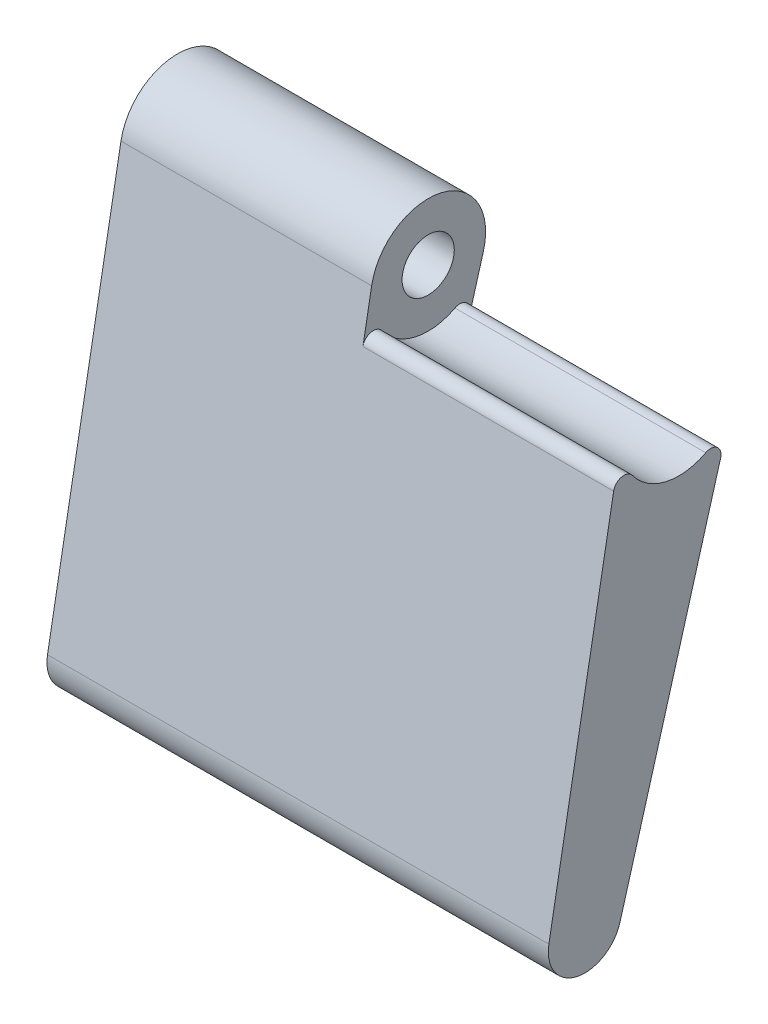
ISO-10303-21;
HEADER;
FILE_DESCRIPTION(('STEP AP214'),'2;1');
FILE_NAME('part.step','',(''),(''),'','','');
FILE_SCHEMA(('AUTOMOTIVE_DESIGN { 1 0 10303 214 1 1 1 1 }'));
ENDSEC;
DATA;
#1=APPLICATION_CONTEXT('core data for automotive mechanical design processes');
#2=APPLICATION_PROTOCOL_DEFINITION('international standard','automotive_design',2000,#1);
#3=PRODUCT_CONTEXT('',#1,'mechanical');
#4=PRODUCT('Part','Part','',(#3));
#5=PRODUCT_RELATED_PRODUCT_CATEGORY('part','',(#4));
#6=PRODUCT_DEFINITION_FORMATION('','',#4);
#7=PRODUCT_DEFINITION_CONTEXT('part definition',#1,'design');
#8=PRODUCT_DEFINITION('design','',#6,#7);
#9=PRODUCT_DEFINITION_SHAPE('','',#8);
#10=(LENGTH_UNIT() NAMED_UNIT(*) SI_UNIT(.MILLI.,.METRE.));
#11=(NAMED_UNIT(*) PLANE_ANGLE_UNIT() SI_UNIT($,.RADIAN.));
#12=(NAMED_UNIT(*) SI_UNIT($,.STERADIAN.) SOLID_ANGLE_UNIT());
#13=UNCERTAINTY_MEASURE_WITH_UNIT(LENGTH_MEASURE(1.E-05),#10,'distance_accuracy_value','');
#14=(GEOMETRIC_REPRESENTATION_CONTEXT(3) GLOBAL_UNCERTAINTY_ASSIGNED_CONTEXT((#13)) GLOBAL_UNIT_ASSIGNED_CONTEXT((#10,
#11,#12)) REPRESENTATION_CONTEXT('',''));
#15=CARTESIAN_POINT('',(0.,0.,0.));
#16=DIRECTION('',(0.,0.,1.));
#17=DIRECTION('',(1.,0.,0.));
#18=AXIS2_PLACEMENT_3D('',#15,#16,#17);
#19=CARTESIAN_POINT('',(63.25,0.,0.));
#20=DIRECTION('',(1.,0.,0.));
#21=DIRECTION('',(0.,0.,-1.));
#22=AXIS2_PLACEMENT_3D('',#19,#20,#21);
#23=PLANE('',#22);
#24=CARTESIAN_POINT('',(63.25,-53.325,78.5));
#25=DIRECTION('',(1.,0.,0.));
#26=DIRECTION('',(0.,0.,-1.));
#27=AXIS2_PLACEMENT_3D('',#24,#25,#26);
#28=CIRCLE('',#27,1.375);
#29=CARTESIAN_POINT('',(63.25,-54.1329219866742,79.6126037315453));
#30=VERTEX_POINT('',#29);
#31=CARTESIAN_POINT('',(63.25,-54.5408078695236,77.8577880222197));
#32=VERTEX_POINT('',#31);
#33=EDGE_CURVE('E133',#30,#32,#28,.T.);
#34=ORIENTED_EDGE('',*,*,#33,.F.);
#35=CARTESIAN_POINT('',(63.25,-54.2798168933422,79.814895319099));
#36=DIRECTION('',(1.,0.,0.));
#37=DIRECTION('',(0.,0.,-1.));
#38=AXIS2_PLACEMENT_3D('',#35,#36,#37);
#39=CIRCLE('',#38,0.250000000000001);
#40=CARTESIAN_POINT('',(63.25,-54.2355392671368,80.0609430620628));
#41=VERTEX_POINT('',#40);
#42=EDGE_CURVE('E127',#30,#41,#39,.T.);
#43=ORIENTED_EDGE('',*,*,#42,.T.);
#44=DIRECTION('',(0.,0.984190971855451,-0.177110504821773));
#45=VECTOR('',#44,1.);
#46=CARTESIAN_POINT('',(63.25,12.2542003124242,68.0957537043475));
#47=LINE('',#46,#45);
#48=CARTESIAN_POINT('',(63.25,-62.850028308281,81.6111671003735));
#49=VERTEX_POINT('',#48);
#50=EDGE_CURVE('E113',#49,#41,#47,.T.);
#51=ORIENTED_EDGE('',*,*,#50,.F.);
#52=CARTESIAN_POINT('',(63.25,-63.005,80.75));
#53=DIRECTION('',(1.,0.,0.));
#54=DIRECTION('',(0.,0.,-1.));
#55=AXIS2_PLACEMENT_3D('',#52,#53,#54);
#56=CIRCLE('',#55,0.875000000000005);
#57=CARTESIAN_POINT('',(63.25,-63.2457309037468,79.9087666007693));
#58=VERTEX_POINT('',#57);
#59=EDGE_CURVE('E157',#49,#58,#56,.T.);
#60=ORIENTED_EDGE('',*,*,#59,.T.);
#61=DIRECTION('',(0.,-0.961409599120805,0.275121032853493));
#62=VECTOR('',#61,1.);
#63=CARTESIAN_POINT('',(63.25,16.3490190809414,57.1315966562123));
#64=LINE('',#63,#62);
#65=CARTESIAN_POINT('',(63.25,-54.830644104014,77.5006698082976));
#66=VERTEX_POINT('',#65);
#67=EDGE_CURVE('E160',#66,#58,#64,.T.);
#68=ORIENTED_EDGE('',*,*,#67,.F.);
#69=CARTESIAN_POINT('',(63.25,-54.7618638458006,77.7410222080778));
#70=DIRECTION('',(1.,0.,0.));
#71=DIRECTION('',(0.,0.,-1.));
#72=AXIS2_PLACEMENT_3D('',#69,#70,#71);
#73=CIRCLE('',#72,0.25);
#74=EDGE_CURVE('E143',#66,#32,#73,.T.);
#75=ORIENTED_EDGE('',*,*,#74,.T.);
#76=EDGE_LOOP('',(#34,#43,#51,#60,#68,#75));
#77=FACE_BOUND('',#76,.T.);
#78=ADVANCED_FACE('F42',(#77),#23,.T.);
#79=CARTESIAN_POINT('',(38.4995137347629,-53.325,78.5));
#80=DIRECTION('',(1.,0.,0.));
#81=DIRECTION('',(0.,0.,-1.));
#82=AXIS2_PLACEMENT_3D('',#79,#80,#81);
#83=CYLINDRICAL_SURFACE('',#82,1.375);
#84=DIRECTION('',(1.,0.,0.));
#85=VECTOR('',#84,1.);
#86=CARTESIAN_POINT('',(38.4995137347629,-53.0814730558701,79.8532625863012));
#87=LINE('',#86,#85);
#88=CARTESIAN_POINT('',(51.25,-53.0814730558701,79.8532625863012));
#89=VERTEX_POINT('',#88);
#90=CARTESIAN_POINT('',(57.25,-53.0814730558701,79.8532625863013));
#91=VERTEX_POINT('',#90);
#92=EDGE_CURVE('E121',#89,#91,#87,.T.);
#93=ORIENTED_EDGE('',*,*,#92,.T.);
#94=CARTESIAN_POINT('',(57.25,-53.325,78.5));
#95=DIRECTION('',(1.,0.,0.));
#96=DIRECTION('',(0.,0.,-1.));
#97=AXIS2_PLACEMENT_3D('',#94,#95,#96);
#98=CIRCLE('',#97,1.375);
#99=CARTESIAN_POINT('',(57.25,-53.7032914201736,77.1780618012089));
#100=VERTEX_POINT('',#99);
#101=EDGE_CURVE('E155',#91,#100,#98,.F.);
#102=ORIENTED_EDGE('',*,*,#101,.T.);
#103=DIRECTION('',(1.,0.,0.));
#104=VECTOR('',#103,1.);
#105=CARTESIAN_POINT('',(38.4995137347629,-53.7032914201736,77.1780618012089));
#106=LINE('',#105,#104);
#107=CARTESIAN_POINT('',(51.25,-53.7032914201736,77.1780618012089));
#108=VERTEX_POINT('',#107);
#109=EDGE_CURVE('E163',#108,#100,#106,.T.);
#110=ORIENTED_EDGE('',*,*,#109,.F.);
#111=CARTESIAN_POINT('',(51.25,-53.325,78.5));
#112=DIRECTION('',(1.,0.,0.));
#113=DIRECTION('',(0.,0.,-1.));
#114=AXIS2_PLACEMENT_3D('',#111,#112,#113);
#115=CIRCLE('',#114,1.375);
#116=EDGE_CURVE('E11',#89,#108,#115,.F.);
#117=ORIENTED_EDGE('',*,*,#116,.F.);
#118=EDGE_LOOP('',(#93,#102,#110,#117));
#119=FACE_BOUND('',#118,.T.);
#120=ADVANCED_FACE('F182',(#119),#83,.T.);
#121=CARTESIAN_POINT('',(38.4995137347629,-53.325,78.5));
#122=DIRECTION('',(1.,0.,0.));
#123=DIRECTION('',(0.,0.,-1.));
#124=AXIS2_PLACEMENT_3D('',#121,#122,#123);
#125=CYLINDRICAL_SURFACE('',#124,0.625000000000006);
#126=CARTESIAN_POINT('',(51.25,-53.325,78.5));
#127=DIRECTION('',(1.,0.,0.));
#128=DIRECTION('',(0.,0.,-1.));
#129=AXIS2_PLACEMENT_3D('',#126,#127,#128);
#130=CIRCLE('',#129,0.625000000000006);
#131=CARTESIAN_POINT('',(51.25,-53.325,77.875));
#132=VERTEX_POINT('',#131);
#133=EDGE_CURVE('E158',#132,#132,#130,.T.);
#134=ORIENTED_EDGE('',*,*,#133,.F.);
#135=EDGE_LOOP('',(#134));
#136=FACE_BOUND('',#135,.T.);
#137=CARTESIAN_POINT('',(57.25,-53.325,78.5));
#138=DIRECTION('',(1.,0.,0.));
#139=DIRECTION('',(0.,0.,-1.));
#140=AXIS2_PLACEMENT_3D('',#137,#138,#139);
#141=CIRCLE('',#140,0.625000000000006);
#142=CARTESIAN_POINT('',(57.25,-53.325,77.875));
#143=VERTEX_POINT('',#142);
#144=EDGE_CURVE('E46',#143,#143,#141,.T.);
#145=ORIENTED_EDGE('',*,*,#144,.T.);
#146=EDGE_LOOP('',(#145));
#147=FACE_BOUND('',#146,.T.);
#148=ADVANCED_FACE('F178',(#136,#147),#125,.F.);
#149=CARTESIAN_POINT('',(38.4995137347629,16.3490190809414,57.1315966562123));
#150=DIRECTION('',(0.,0.275121032853493,0.961409599120805));
#151=DIRECTION('',(0.,-0.961409599120805,0.275121032853493));
#152=AXIS2_PLACEMENT_3D('',#149,#150,#151);
#153=PLANE('',#152);
#154=ORIENTED_EDGE('',*,*,#67,.T.);
#155=DIRECTION('',(1.,0.,0.));
#156=VECTOR('',#155,1.);
#157=CARTESIAN_POINT('',(38.4995137347629,-63.2457309037468,79.9087666007693));
#158=LINE('',#157,#156);
#159=CARTESIAN_POINT('',(51.25,-63.2457309037468,79.9087666007693));
#160=VERTEX_POINT('',#159);
#161=EDGE_CURVE('E162',#160,#58,#158,.T.);
#162=ORIENTED_EDGE('',*,*,#161,.F.);
#163=DIRECTION('',(0.,0.961409599120805,-0.275121032853493));
#164=VECTOR('',#163,1.);
#165=CARTESIAN_POINT('',(51.25,16.3490190809414,57.1315966562123));
#166=LINE('',#165,#164);
#167=EDGE_CURVE('E67',#160,#108,#166,.T.);
#168=ORIENTED_EDGE('',*,*,#167,.T.);
#169=ORIENTED_EDGE('',*,*,#109,.T.);
#170=DIRECTION('',(0.,0.961409599120805,-0.275121032853493));
#171=VECTOR('',#170,1.);
#172=CARTESIAN_POINT('',(57.25,16.3490190809414,57.1315966562123));
#173=LINE('',#172,#171);
#174=CARTESIAN_POINT('',(57.25,-54.830644104014,77.5006698082976));
#175=VERTEX_POINT('',#174);
#176=EDGE_CURVE('E142',#175,#100,#173,.T.);
#177=ORIENTED_EDGE('',*,*,#176,.F.);
#178=DIRECTION('',(1.,0.,0.));
#179=VECTOR('',#178,1.);
#180=CARTESIAN_POINT('',(54.6558993230765,-54.830644104014,77.5006698082976));
#181=LINE('',#180,#179);
#182=EDGE_CURVE('E137',#175,#66,#181,.T.);
#183=ORIENTED_EDGE('',*,*,#182,.T.);
#184=EDGE_LOOP('',(#154,#162,#168,#169,#177,#183));
#185=FACE_BOUND('',#184,.T.);
#186=ADVANCED_FACE('F181',(#185),#153,.F.);
#187=CARTESIAN_POINT('',(38.4995137347629,-63.005,80.75));
#188=DIRECTION('',(1.,0.,0.));
#189=DIRECTION('',(0.,0.,-1.));
#190=AXIS2_PLACEMENT_3D('',#187,#188,#189);
#191=CYLINDRICAL_SURFACE('',#190,0.875000000000005);
#192=CARTESIAN_POINT('',(51.25,-63.005,80.75));
#193=DIRECTION('',(1.,0.,0.));
#194=DIRECTION('',(0.,0.,-1.));
#195=AXIS2_PLACEMENT_3D('',#192,#193,#194);
#196=CIRCLE('',#195,0.875000000000005);
#197=CARTESIAN_POINT('',(51.25,-62.850028308281,81.6111671003735));
#198=VERTEX_POINT('',#197);
#199=EDGE_CURVE('E51',#160,#198,#196,.F.);
#200=ORIENTED_EDGE('',*,*,#199,.F.);
#201=ORIENTED_EDGE('',*,*,#161,.T.);
#202=ORIENTED_EDGE('',*,*,#59,.F.);
#203=DIRECTION('',(1.,0.,0.));
#204=VECTOR('',#203,1.);
#205=CARTESIAN_POINT('',(38.4995137347629,-62.850028308281,81.6111671003735));
#206=LINE('',#205,#204);
#207=EDGE_CURVE('E85',#198,#49,#206,.T.);
#208=ORIENTED_EDGE('',*,*,#207,.F.);
#209=EDGE_LOOP('',(#200,#201,#202,#208));
#210=FACE_BOUND('',#209,.T.);
#211=ADVANCED_FACE('F209',(#210),#191,.T.);
#212=CARTESIAN_POINT('',(38.4995137347629,12.2542003124242,68.0957537043475));
#213=DIRECTION('',(0.,-0.177110504821773,-0.984190971855451));
#214=DIRECTION('',(0.,0.984190971855451,-0.177110504821773));
#215=AXIS2_PLACEMENT_3D('',#212,#213,#214);
#216=PLANE('',#215);
#217=ORIENTED_EDGE('',*,*,#50,.T.);
#218=DIRECTION('',(1.,0.,0.));
#219=VECTOR('',#218,1.);
#220=CARTESIAN_POINT('',(54.6558993230765,-54.2355392671368,80.0609430620628));
#221=LINE('',#220,#219);
#222=CARTESIAN_POINT('',(57.25,-54.2355392671368,80.0609430620628));
#223=VERTEX_POINT('',#222);
#224=EDGE_CURVE('E116',#223,#41,#221,.T.);
#225=ORIENTED_EDGE('',*,*,#224,.F.);
#226=DIRECTION('',(0.,-0.984190971855451,0.177110504821773));
#227=VECTOR('',#226,1.);
#228=CARTESIAN_POINT('',(57.25,12.2542003124242,68.0957537043475));
#229=LINE('',#228,#227);
#230=EDGE_CURVE('E152',#91,#223,#229,.T.);
#231=ORIENTED_EDGE('',*,*,#230,.F.);
#232=ORIENTED_EDGE('',*,*,#92,.F.);
#233=DIRECTION('',(0.,-0.984190971855451,0.177110504821773));
#234=VECTOR('',#233,1.);
#235=CARTESIAN_POINT('',(51.25,12.2542003124242,68.0957537043475));
#236=LINE('',#235,#234);
#237=EDGE_CURVE('E166',#89,#198,#236,.T.);
#238=ORIENTED_EDGE('',*,*,#237,.T.);
#239=ORIENTED_EDGE('',*,*,#207,.T.);
#240=EDGE_LOOP('',(#217,#225,#231,#232,#238,#239));
#241=FACE_BOUND('',#240,.T.);
#242=ADVANCED_FACE('F115',(#241),#216,.F.);
#243=CARTESIAN_POINT('',(51.25,0.,0.));
#244=DIRECTION('',(1.,0.,0.));
#245=DIRECTION('',(0.,0.,-1.));
#246=AXIS2_PLACEMENT_3D('',#243,#244,#245);
#247=PLANE('',#246);
#248=ORIENTED_EDGE('',*,*,#133,.T.);
#249=EDGE_LOOP('',(#248));
#250=FACE_BOUND('',#249,.T.);
#251=ORIENTED_EDGE('',*,*,#199,.T.);
#252=ORIENTED_EDGE('',*,*,#237,.F.);
#253=ORIENTED_EDGE('',*,*,#116,.T.);
#254=ORIENTED_EDGE('',*,*,#167,.F.);
#255=EDGE_LOOP('',(#251,#252,#253,#254));
#256=FACE_BOUND('',#255,.T.);
#257=ADVANCED_FACE('F44',(#250,#256),#247,.F.);
#258=CARTESIAN_POINT('',(53.360912703474,-53.325,78.5));
#259=DIRECTION('',(1.,0.,0.));
#260=DIRECTION('',(0.,0.,-1.));
#261=AXIS2_PLACEMENT_3D('',#258,#259,#260);
#262=CYLINDRICAL_SURFACE('',#261,1.375);
#263=CARTESIAN_POINT('',(57.25,-54.5408078695236,77.8577880222197));
#264=VERTEX_POINT('',#263);
#265=CARTESIAN_POINT('',(57.25,-54.1329219866742,79.6126037315453));
#266=VERTEX_POINT('',#265);
#267=EDGE_CURVE('E59',#264,#266,#98,.F.);
#268=ORIENTED_EDGE('',*,*,#267,.T.);
#269=DIRECTION('',(1.,0.,0.));
#270=VECTOR('',#269,1.);
#271=CARTESIAN_POINT('',(54.6558993230765,-54.1329219866742,79.6126037315453));
#272=LINE('',#271,#270);
#273=EDGE_CURVE('E129',#266,#30,#272,.T.);
#274=ORIENTED_EDGE('',*,*,#273,.T.);
#275=ORIENTED_EDGE('',*,*,#33,.T.);
#276=DIRECTION('',(1.,0.,0.));
#277=VECTOR('',#276,1.);
#278=CARTESIAN_POINT('',(54.6558993230765,-54.5408078695236,77.8577880222197));
#279=LINE('',#278,#277);
#280=EDGE_CURVE('E145',#264,#32,#279,.T.);
#281=ORIENTED_EDGE('',*,*,#280,.F.);
#282=EDGE_LOOP('',(#268,#274,#275,#281));
#283=FACE_BOUND('',#282,.T.);
#284=ADVANCED_FACE('F189',(#283),#262,.F.);
#285=CARTESIAN_POINT('',(57.25,-53.325,78.5));
#286=DIRECTION('',(1.,0.,0.));
#287=DIRECTION('',(0.,0.,-1.));
#288=AXIS2_PLACEMENT_3D('',#285,#286,#287);
#289=PLANE('',#288);
#290=CARTESIAN_POINT('',(57.25,-54.2798168933422,79.814895319099));
#291=DIRECTION('',(1.,0.,0.));
#292=DIRECTION('',(0.,0.,-1.));
#293=AXIS2_PLACEMENT_3D('',#290,#291,#292);
#294=CIRCLE('',#293,0.250000000000001);
#295=EDGE_CURVE('E128',#223,#266,#294,.F.);
#296=ORIENTED_EDGE('',*,*,#295,.T.);
#297=ORIENTED_EDGE('',*,*,#267,.F.);
#298=CARTESIAN_POINT('',(57.25,-54.7618638458006,77.7410222080778));
#299=DIRECTION('',(1.,0.,0.));
#300=DIRECTION('',(0.,0.,-1.));
#301=AXIS2_PLACEMENT_3D('',#298,#299,#300);
#302=CIRCLE('',#301,0.25);
#303=EDGE_CURVE('E134',#264,#175,#302,.F.);
#304=ORIENTED_EDGE('',*,*,#303,.T.);
#305=ORIENTED_EDGE('',*,*,#176,.T.);
#306=ORIENTED_EDGE('',*,*,#101,.F.);
#307=ORIENTED_EDGE('',*,*,#230,.T.);
#308=EDGE_LOOP('',(#296,#297,#304,#305,#306,#307));
#309=FACE_BOUND('',#308,.T.);
#310=ORIENTED_EDGE('',*,*,#144,.F.);
#311=EDGE_LOOP('',(#310));
#312=FACE_BOUND('',#311,.T.);
#313=ADVANCED_FACE('F186',(#309,#312),#289,.T.);
#314=CARTESIAN_POINT('',(54.6558993230765,-54.7618638458006,77.7410222080778));
#315=DIRECTION('',(1.,0.,0.));
#316=DIRECTION('',(0.,0.,-1.));
#317=AXIS2_PLACEMENT_3D('',#314,#315,#316);
#318=CYLINDRICAL_SURFACE('',#317,0.25);
#319=ORIENTED_EDGE('',*,*,#280,.T.);
#320=ORIENTED_EDGE('',*,*,#74,.F.);
#321=ORIENTED_EDGE('',*,*,#182,.F.);
#322=ORIENTED_EDGE('',*,*,#303,.F.);
#323=EDGE_LOOP('',(#319,#320,#321,#322));
#324=FACE_BOUND('',#323,.T.);
#325=ADVANCED_FACE('F188',(#324),#318,.T.);
#326=CARTESIAN_POINT('',(54.6558993230765,-54.2798168933422,79.814895319099));
#327=DIRECTION('',(1.,0.,0.));
#328=DIRECTION('',(0.,0.,-1.));
#329=AXIS2_PLACEMENT_3D('',#326,#327,#328);
#330=CYLINDRICAL_SURFACE('',#329,0.250000000000001);
#331=ORIENTED_EDGE('',*,*,#224,.T.);
#332=ORIENTED_EDGE('',*,*,#42,.F.);
#333=ORIENTED_EDGE('',*,*,#273,.F.);
#334=ORIENTED_EDGE('',*,*,#295,.F.);
#335=EDGE_LOOP('',(#331,#332,#333,#334));
#336=FACE_BOUND('',#335,.T.);
#337=ADVANCED_FACE('F125',(#336),#330,.T.);
#338=CLOSED_SHELL('',(#78,#120,#148,#186,#211,#242,#257,#284,#313,#325,#337));
#339=MANIFOLD_SOLID_BREP('B2',#338);
#340=ADVANCED_BREP_SHAPE_REPRESENTATION('',(#18,#339),#14);
#341=SHAPE_DEFINITION_REPRESENTATION(#9,#340);
ENDSEC;
END-ISO-10303-21;
